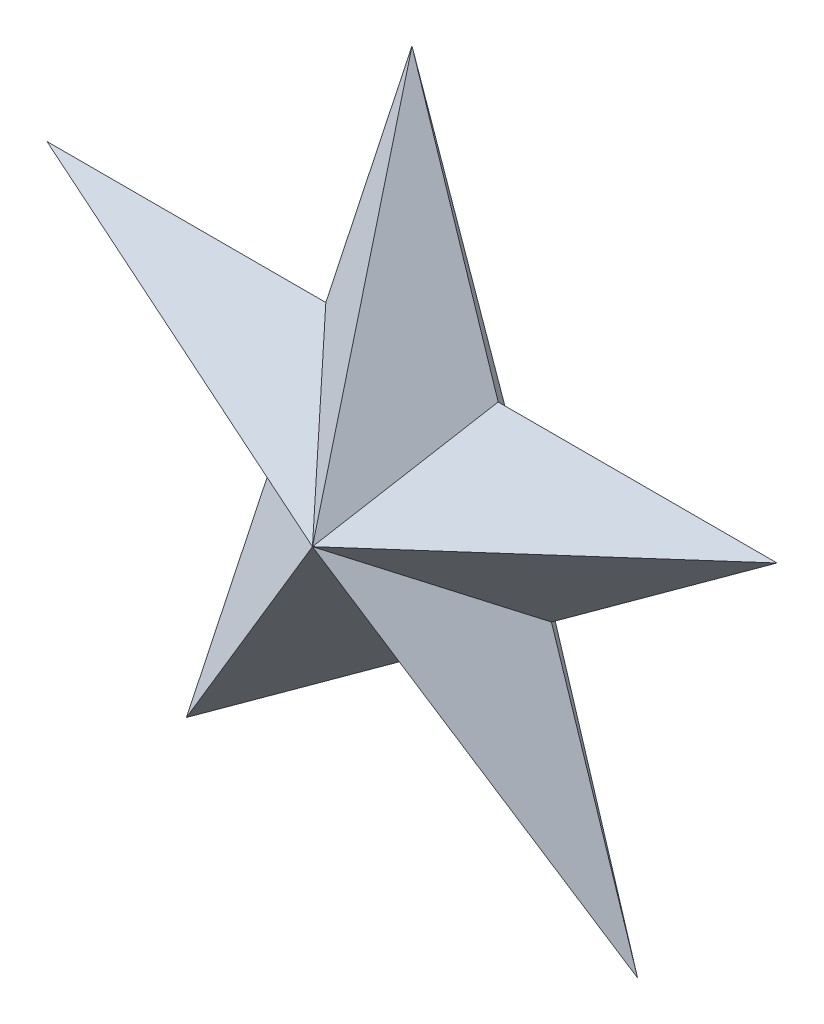
ISO-10303-21;
HEADER;
FILE_DESCRIPTION(('STEP AP214'),'2;1');
FILE_NAME('part.step','',(''),(''),'','','');
FILE_SCHEMA(('AUTOMOTIVE_DESIGN { 1 0 10303 214 1 1 1 1 }'));
ENDSEC;
DATA;
#1=APPLICATION_CONTEXT('core data for automotive mechanical design processes');
#2=APPLICATION_PROTOCOL_DEFINITION('international standard','automotive_design',2000,#1);
#3=PRODUCT_CONTEXT('',#1,'mechanical');
#4=PRODUCT('Part','Part','',(#3));
#5=PRODUCT_RELATED_PRODUCT_CATEGORY('part','',(#4));
#6=PRODUCT_DEFINITION_FORMATION('','',#4);
#7=PRODUCT_DEFINITION_CONTEXT('part definition',#1,'design');
#8=PRODUCT_DEFINITION('design','',#6,#7);
#9=PRODUCT_DEFINITION_SHAPE('','',#8);
#10=(LENGTH_UNIT() NAMED_UNIT(*) SI_UNIT(.MILLI.,.METRE.));
#11=(NAMED_UNIT(*) PLANE_ANGLE_UNIT() SI_UNIT($,.RADIAN.));
#12=(NAMED_UNIT(*) SI_UNIT($,.STERADIAN.) SOLID_ANGLE_UNIT());
#13=UNCERTAINTY_MEASURE_WITH_UNIT(LENGTH_MEASURE(1.E-05),#10,'distance_accuracy_value','');
#14=(GEOMETRIC_REPRESENTATION_CONTEXT(3) GLOBAL_UNCERTAINTY_ASSIGNED_CONTEXT((#13)) GLOBAL_UNIT_ASSIGNED_CONTEXT((#10,
#11,#12)) REPRESENTATION_CONTEXT('',''));
#15=CARTESIAN_POINT('',(0.,0.,0.));
#16=DIRECTION('',(0.,0.,1.));
#17=DIRECTION('',(1.,0.,0.));
#18=AXIS2_PLACEMENT_3D('',#15,#16,#17);
#19=CARTESIAN_POINT('',(55.9016994374964,18.1635632001327,0.));
#20=DIRECTION('',(0.611327344786174,0.198632295166773,-0.766044443118979));
#21=DIRECTION('',(-0.781618915499374,0.,-0.623756259233992));
#22=AXIS2_PLACEMENT_3D('',#19,#20,#21);
#23=PLANE('',#22);
#24=DIRECTION('',(0.309016994374919,-0.951056516295163,0.));
#25=VECTOR('',#24,1.);
#26=CARTESIAN_POINT('',(55.9016994374964,18.1635632001327,0.));
#27=LINE('',#26,#25);
#28=CARTESIAN_POINT('',(50.000000000002,36.3271264002678,0.));
#29=VERTEX_POINT('',#28);
#30=CARTESIAN_POINT('',(61.8033988749902,0.,0.));
#31=VERTEX_POINT('',#30);
#32=EDGE_CURVE('E107',#29,#31,#27,.T.);
#33=ORIENTED_EDGE('',*,*,#32,.T.);
#34=DIRECTION('',(0.486316038320695,0.66935660277975,0.561656878518563));
#35=VECTOR('',#34,1.);
#36=CARTESIAN_POINT('',(66.3202097747762,6.21685686065244,5.21656229885539));
#37=LINE('',#36,#35);
#38=CARTESIAN_POINT('',(49.9999999999999,-16.245984811645,-13.6319998635633));
#39=VERTEX_POINT('',#38);
#40=EDGE_CURVE('E11',#39,#31,#37,.T.);
#41=ORIENTED_EDGE('',*,*,#40,.F.);
#42=DIRECTION('',(0.,0.967988247041311,0.250995525039569));
#43=VECTOR('',#42,1.);
#44=CARTESIAN_POINT('',(50.0000000000015,19.3078450424926,-4.41303236196072));
#45=LINE('',#44,#43);
#46=EDGE_CURVE('E120',#39,#29,#45,.T.);
#47=ORIENTED_EDGE('',*,*,#46,.T.);
#48=EDGE_LOOP('',(#33,#41,#47));
#49=FACE_BOUND('',#48,.T.);
#50=ADVANCED_FACE('F41',(#49),#23,.T.);
#51=CARTESIAN_POINT('',(0.,0.,0.));
#52=DIRECTION('',(0.,0.642787609686538,-0.766044443118979));
#53=DIRECTION('',(0.,0.766044443118979,0.642787609686538));
#54=AXIS2_PLACEMENT_3D('',#51,#52,#53);
#55=PLANE('',#54);
#56=DIRECTION('',(1.,0.,0.));
#57=VECTOR('',#56,1.);
#58=CARTESIAN_POINT('',(0.,0.,0.));
#59=LINE('',#58,#57);
#60=CARTESIAN_POINT('',(100.,0.,0.));
#61=VERTEX_POINT('',#60);
#62=EDGE_CURVE('E124',#31,#61,#59,.T.);
#63=ORIENTED_EDGE('',*,*,#62,.T.);
#64=DIRECTION('',(0.920611530045763,0.299124818690978,0.250995525039569));
#65=VECTOR('',#64,1.);
#66=CARTESIAN_POINT('',(31.4337395126516,-22.2785285293753,-18.6939050721713));
#67=LINE('',#66,#65);
#68=EDGE_CURVE('E45',#39,#61,#67,.T.);
#69=ORIENTED_EDGE('',*,*,#68,.F.);
#70=ORIENTED_EDGE('',*,*,#40,.T.);
#71=EDGE_LOOP('',(#63,#69,#70));
#72=FACE_BOUND('',#71,.T.);
#73=ADVANCED_FACE('F43',(#72),#55,.T.);
#74=CARTESIAN_POINT('',(34.5491502812521,-47.5528258147575,0.));
#75=DIRECTION('',(0.377821077330075,-0.520026100010062,-0.766044443118979));
#76=DIRECTION('',(0.,0.827370262224101,-0.561656878518569));
#77=AXIS2_PLACEMENT_3D('',#74,#75,#76);
#78=PLANE('',#77);
#79=DIRECTION('',(-0.809016994374951,-0.587785252292469,0.));
#80=VECTOR('',#79,1.);
#81=CARTESIAN_POINT('',(34.5491502812521,-47.5528258147575,0.));
#82=LINE('',#81,#80);
#83=CARTESIAN_POINT('',(69.0983005625052,-22.4513988289791,0.));
#84=VERTEX_POINT('',#83);
#85=EDGE_CURVE('E64',#61,#84,#82,.T.);
#86=ORIENTED_EDGE('',*,*,#85,.T.);
#87=DIRECTION('',(0.786875879277055,-0.255671471667717,0.561656878518571));
#88=VECTOR('',#87,1.);
#89=CARTESIAN_POINT('',(52.7563252063231,-17.1415691604024,-11.6645879091039));
#90=LINE('',#89,#88);
#91=EDGE_CURVE('E181',#39,#84,#90,.T.);
#92=ORIENTED_EDGE('',*,*,#91,.F.);
#93=ORIENTED_EDGE('',*,*,#68,.T.);
#94=EDGE_LOOP('',(#86,#92,#93));
#95=FACE_BOUND('',#94,.T.);
#96=ADVANCED_FACE('F188',(#95),#78,.T.);
#97=CARTESIAN_POINT('',(55.9016994374964,18.1635632001327,0.));
#98=DIRECTION('',(0.611327344786174,0.198632295166773,-0.766044443118979));
#99=DIRECTION('',(-0.781618915499374,0.,-0.623756259233992));
#100=AXIS2_PLACEMENT_3D('',#97,#98,#99);
#101=PLANE('',#100);
#102=DIRECTION('',(0.309016994374919,-0.951056516295163,0.));
#103=VECTOR('',#102,1.);
#104=CARTESIAN_POINT('',(55.9016994374964,18.1635632001327,0.));
#105=LINE('',#104,#103);
#106=CARTESIAN_POINT('',(80.9016994374939,-58.7785252292485,0.));
#107=VERTEX_POINT('',#106);
#108=EDGE_CURVE('E152',#84,#107,#105,.T.);
#109=ORIENTED_EDGE('',*,*,#108,.T.);
#110=DIRECTION('',(0.568969216003308,-0.783118942211647,0.250995525039577));
#111=VECTOR('',#110,1.);
#112=CARTESIAN_POINT('',(28.5217373881198,13.3163075304795,-23.1069374341323));
#113=LINE('',#112,#111);
#114=EDGE_CURVE('E178',#39,#107,#113,.T.);
#115=ORIENTED_EDGE('',*,*,#114,.F.);
#116=ORIENTED_EDGE('',*,*,#91,.T.);
#117=EDGE_LOOP('',(#109,#115,#116));
#118=FACE_BOUND('',#117,.T.);
#119=ADVANCED_FACE('F276',(#118),#101,.T.);
#120=CARTESIAN_POINT('',(0.,0.,0.));
#121=DIRECTION('',(-0.377821077330085,-0.520026100010054,-0.766044443118979));
#122=DIRECTION('',(0.,0.827370262224105,-0.561656878518563));
#123=AXIS2_PLACEMENT_3D('',#120,#121,#122);
#124=PLANE('',#123);
#125=DIRECTION('',(-0.809016994374939,0.587785252292485,0.));
#126=VECTOR('',#125,1.);
#127=CARTESIAN_POINT('',(0.,0.,0.));
#128=LINE('',#127,#126);
#129=CARTESIAN_POINT('',(49.9999999999989,-36.3271264002684,0.));
#130=VERTEX_POINT('',#129);
#131=EDGE_CURVE('E148',#107,#130,#128,.T.);
#132=ORIENTED_EDGE('',*,*,#131,.T.);
#133=DIRECTION('',(0.,-0.827370262224103,0.561656878518566));
#134=VECTOR('',#133,1.);
#135=CARTESIAN_POINT('',(49.9999999999992,-11.4596989576571,-16.8811502079596));
#136=LINE('',#135,#134);
#137=EDGE_CURVE('E174',#39,#130,#136,.T.);
#138=ORIENTED_EDGE('',*,*,#137,.F.);
#139=ORIENTED_EDGE('',*,*,#114,.T.);
#140=EDGE_LOOP('',(#132,#138,#139));
#141=FACE_BOUND('',#140,.T.);
#142=ADVANCED_FACE('F272',(#141),#124,.T.);
#143=CARTESIAN_POINT('',(34.5491502812521,-47.5528258147575,0.));
#144=DIRECTION('',(0.377821077330075,-0.520026100010062,-0.766044443118979));
#145=DIRECTION('',(0.,0.827370262224101,-0.561656878518569));
#146=AXIS2_PLACEMENT_3D('',#143,#144,#145);
#147=PLANE('',#146);
#148=DIRECTION('',(-0.809016994374951,-0.587785252292469,0.));
#149=VECTOR('',#148,1.);
#150=CARTESIAN_POINT('',(34.5491502812521,-47.5528258147575,0.));
#151=LINE('',#150,#149);
#152=CARTESIAN_POINT('',(19.0983005625049,-58.7785252292469,0.));
#153=VERTEX_POINT('',#152);
#154=EDGE_CURVE('E144',#130,#153,#151,.T.);
#155=ORIENTED_EDGE('',*,*,#154,.T.);
#156=DIRECTION('',(-0.568969216003338,-0.783118942211628,0.250995525039565));
#157=VECTOR('',#156,1.);
#158=CARTESIAN_POINT('',(45.288281587193,-22.7311088493843,-11.5534687170654));
#159=LINE('',#158,#157);
#160=EDGE_CURVE('E170',#39,#153,#159,.T.);
#161=ORIENTED_EDGE('',*,*,#160,.F.);
#162=ORIENTED_EDGE('',*,*,#137,.T.);
#163=EDGE_LOOP('',(#155,#161,#162));
#164=FACE_BOUND('',#163,.T.);
#165=ADVANCED_FACE('F268',(#164),#147,.T.);
#166=CARTESIAN_POINT('',(34.5491502812531,-11.2256994144907,0.));
#167=DIRECTION('',(-0.611327344786163,0.198632295166806,-0.766044443118979));
#168=DIRECTION('',(-0.781618915499379,0.,0.623756259233985));
#169=AXIS2_PLACEMENT_3D('',#166,#167,#168);
#170=PLANE('',#169);
#171=DIRECTION('',(0.30901699437497,0.951056516295146,0.));
#172=VECTOR('',#171,1.);
#173=CARTESIAN_POINT('',(34.5491502812531,-11.2256994144907,0.));
#174=LINE('',#173,#172);
#175=CARTESIAN_POINT('',(30.901699437495,-22.4513988289801,0.));
#176=VERTEX_POINT('',#175);
#177=EDGE_CURVE('E140',#153,#176,#174,.T.);
#178=ORIENTED_EDGE('',*,*,#177,.T.);
#179=DIRECTION('',(-0.786875879277068,-0.255671471667689,0.561656878518566));
#180=VECTOR('',#179,1.);
#181=CARTESIAN_POINT('',(35.4185103372812,-20.9837980034802,-3.2240128051241));
#182=LINE('',#181,#180);
#183=EDGE_CURVE('E166',#39,#176,#182,.T.);
#184=ORIENTED_EDGE('',*,*,#183,.F.);
#185=ORIENTED_EDGE('',*,*,#160,.T.);
#186=EDGE_LOOP('',(#178,#184,#185));
#187=FACE_BOUND('',#186,.T.);
#188=ADVANCED_FACE('F264',(#187),#170,.T.);
#189=CARTESIAN_POINT('',(0.,0.,0.));
#190=DIRECTION('',(-0.377821077330085,-0.520026100010054,-0.766044443118979));
#191=DIRECTION('',(0.,0.827370262224105,-0.561656878518563));
#192=AXIS2_PLACEMENT_3D('',#189,#190,#191);
#193=PLANE('',#192);
#194=DIRECTION('',(-0.809016994374939,0.587785252292485,0.));
#195=VECTOR('',#194,1.);
#196=CARTESIAN_POINT('',(0.,0.,0.));
#197=LINE('',#196,#195);
#198=CARTESIAN_POINT('',(0.,0.,0.));
#199=VERTEX_POINT('',#198);
#200=EDGE_CURVE('E133',#176,#199,#197,.T.);
#201=ORIENTED_EDGE('',*,*,#200,.T.);
#202=DIRECTION('',(-0.920611530045758,0.299124818690986,0.250995525039576));
#203=VECTOR('',#202,1.);
#204=CARTESIAN_POINT('',(0.,0.,0.));
#205=LINE('',#204,#203);
#206=EDGE_CURVE('E162',#39,#199,#205,.T.);
#207=ORIENTED_EDGE('',*,*,#206,.F.);
#208=ORIENTED_EDGE('',*,*,#183,.T.);
#209=EDGE_LOOP('',(#201,#207,#208));
#210=FACE_BOUND('',#209,.T.);
#211=ADVANCED_FACE('F260',(#210),#193,.T.);
#212=CARTESIAN_POINT('',(0.,0.,0.));
#213=DIRECTION('',(0.,0.642787609686538,-0.766044443118979));
#214=DIRECTION('',(0.,0.766044443118979,0.642787609686538));
#215=AXIS2_PLACEMENT_3D('',#212,#213,#214);
#216=PLANE('',#215);
#217=DIRECTION('',(1.,0.,0.));
#218=VECTOR('',#217,1.);
#219=CARTESIAN_POINT('',(0.,0.,0.));
#220=LINE('',#219,#218);
#221=CARTESIAN_POINT('',(38.1966011250116,0.,0.));
#222=VERTEX_POINT('',#221);
#223=EDGE_CURVE('E130',#199,#222,#220,.T.);
#224=ORIENTED_EDGE('',*,*,#223,.T.);
#225=DIRECTION('',(-0.486316038320674,0.669356602779759,0.561656878518571));
#226=VECTOR('',#225,1.);
#227=CARTESIAN_POINT('',(29.1629793254393,12.4337137213059,10.4331245977116));
#228=LINE('',#227,#226);
#229=EDGE_CURVE('E123',#39,#222,#228,.T.);
#230=ORIENTED_EDGE('',*,*,#229,.F.);
#231=ORIENTED_EDGE('',*,*,#206,.T.);
#232=EDGE_LOOP('',(#224,#230,#231));
#233=FACE_BOUND('',#232,.T.);
#234=ADVANCED_FACE('F257',(#233),#216,.T.);
#235=CARTESIAN_POINT('',(34.5491502812531,-11.2256994144907,0.));
#236=DIRECTION('',(-0.611327344786163,0.198632295166806,-0.766044443118979));
#237=DIRECTION('',(-0.781618915499379,0.,0.623756259233985));
#238=AXIS2_PLACEMENT_3D('',#235,#236,#237);
#239=PLANE('',#238);
#240=DIRECTION('',(0.30901699437497,0.951056516295146,0.));
#241=VECTOR('',#240,1.);
#242=CARTESIAN_POINT('',(34.5491502812531,-11.2256994144907,0.));
#243=LINE('',#242,#241);
#244=EDGE_CURVE('E101',#222,#29,#243,.T.);
#245=ORIENTED_EDGE('',*,*,#244,.T.);
#246=ORIENTED_EDGE('',*,*,#46,.F.);
#247=ORIENTED_EDGE('',*,*,#229,.T.);
#248=EDGE_LOOP('',(#245,#246,#247));
#249=FACE_BOUND('',#248,.T.);
#250=ADVANCED_FACE('F126',(#249),#239,.T.);
#251=CARTESIAN_POINT('',(55.9016994374964,18.1635632001327,0.));
#252=DIRECTION('',(0.611327344786174,0.198632295166773,0.766044443118979));
#253=DIRECTION('',(0.781618915499374,0.,-0.623756259233992));
#254=AXIS2_PLACEMENT_3D('',#251,#252,#253);
#255=PLANE('',#254);
#256=ORIENTED_EDGE('',*,*,#32,.F.);
#257=DIRECTION('',(0.,0.967988247041311,-0.250995525039569));
#258=VECTOR('',#257,1.);
#259=CARTESIAN_POINT('',(50.0000000000008,-8.22993065848421,11.5534687170661));
#260=LINE('',#259,#258);
#261=CARTESIAN_POINT('',(50.0000000000009,-16.2459848116462,13.6319998635636));
#262=VERTEX_POINT('',#261);
#263=EDGE_CURVE('E97',#262,#29,#260,.T.);
#264=ORIENTED_EDGE('',*,*,#263,.F.);
#265=DIRECTION('',(0.486316038320695,0.66935660277975,-0.561656878518563));
#266=VECTOR('',#265,1.);
#267=CARTESIAN_POINT('',(47.1866917617692,-20.1181714074591,16.8811502079601));
#268=LINE('',#267,#266);
#269=EDGE_CURVE('E113',#262,#31,#268,.T.);
#270=ORIENTED_EDGE('',*,*,#269,.T.);
#271=EDGE_LOOP('',(#256,#264,#270));
#272=FACE_BOUND('',#271,.T.);
#273=ADVANCED_FACE('F111',(#272),#255,.T.);
#274=CARTESIAN_POINT('',(34.5491502812531,-11.2256994144907,0.));
#275=DIRECTION('',(-0.611327344786163,0.198632295166806,0.766044443118979));
#276=DIRECTION('',(0.781618915499379,0.,0.623756259233985));
#277=AXIS2_PLACEMENT_3D('',#274,#275,#276);
#278=PLANE('',#277);
#279=ORIENTED_EDGE('',*,*,#244,.F.);
#280=DIRECTION('',(-0.486316038320674,0.669356602779759,-0.561656878518571));
#281=VECTOR('',#280,1.);
#282=CARTESIAN_POINT('',(40.9881437818356,-3.84222884307676,3.22401280512441));
#283=LINE('',#282,#281);
#284=EDGE_CURVE('E103',#262,#222,#283,.T.);
#285=ORIENTED_EDGE('',*,*,#284,.F.);
#286=ORIENTED_EDGE('',*,*,#263,.T.);
#287=EDGE_LOOP('',(#279,#285,#286));
#288=FACE_BOUND('',#287,.T.);
#289=ADVANCED_FACE('F99',(#288),#278,.T.);
#290=CARTESIAN_POINT('',(0.,0.,0.));
#291=DIRECTION('',(0.,0.642787609686538,0.766044443118979));
#292=DIRECTION('',(0.,-0.766044443118979,0.642787609686538));
#293=AXIS2_PLACEMENT_3D('',#290,#291,#292);
#294=PLANE('',#293);
#295=ORIENTED_EDGE('',*,*,#223,.F.);
#296=DIRECTION('',(-0.920611530045758,0.299124818690986,-0.250995525039576));
#297=VECTOR('',#296,1.);
#298=CARTESIAN_POINT('',(0.,0.,0.));
#299=LINE('',#298,#297);
#300=EDGE_CURVE('E212',#262,#199,#299,.T.);
#301=ORIENTED_EDGE('',*,*,#300,.F.);
#302=ORIENTED_EDGE('',*,*,#284,.T.);
#303=EDGE_LOOP('',(#295,#301,#302));
#304=FACE_BOUND('',#303,.T.);
#305=ADVANCED_FACE('F217',(#304),#294,.T.);
#306=CARTESIAN_POINT('',(0.,0.,0.));
#307=DIRECTION('',(-0.377821077330085,-0.520026100010054,0.766044443118979));
#308=DIRECTION('',(0.,-0.827370262224105,-0.561656878518563));
#309=AXIS2_PLACEMENT_3D('',#306,#307,#308);
#310=PLANE('',#309);
#311=ORIENTED_EDGE('',*,*,#200,.F.);
#312=DIRECTION('',(-0.786875879277068,-0.255671471667689,-0.561656878518566));
#313=VECTOR('',#312,1.);
#314=CARTESIAN_POINT('',(16.2849923242744,-27.2006548641328,-10.4331245977117));
#315=LINE('',#314,#313);
#316=EDGE_CURVE('E209',#262,#176,#315,.T.);
#317=ORIENTED_EDGE('',*,*,#316,.F.);
#318=ORIENTED_EDGE('',*,*,#300,.T.);
#319=EDGE_LOOP('',(#311,#317,#318));
#320=FACE_BOUND('',#319,.T.);
#321=ADVANCED_FACE('F222',(#320),#310,.T.);
#322=CARTESIAN_POINT('',(34.5491502812531,-11.2256994144907,0.));
#323=DIRECTION('',(-0.611327344786163,0.198632295166806,0.766044443118979));
#324=DIRECTION('',(0.781618915499379,0.,0.623756259233985));
#325=AXIS2_PLACEMENT_3D('',#322,#323,#324);
#326=PLANE('',#325);
#327=ORIENTED_EDGE('',*,*,#177,.F.);
#328=DIRECTION('',(-0.568969216003338,-0.783118942211628,-0.250995525039565));
#329=VECTOR('',#328,1.);
#330=CARTESIAN_POINT('',(29.101983149221,-45.0096373787589,4.41303236196038));
#331=LINE('',#330,#329);
#332=EDGE_CURVE('E206',#262,#153,#331,.T.);
#333=ORIENTED_EDGE('',*,*,#332,.F.);
#334=ORIENTED_EDGE('',*,*,#316,.T.);
#335=EDGE_LOOP('',(#327,#333,#334));
#336=FACE_BOUND('',#335,.T.);
#337=ADVANCED_FACE('F226',(#336),#326,.T.);
#338=CARTESIAN_POINT('',(34.5491502812521,-47.5528258147575,0.));
#339=DIRECTION('',(0.377821077330075,-0.520026100010062,0.766044443118979));
#340=DIRECTION('',(0.,-0.827370262224101,-0.561656878518569));
#341=AXIS2_PLACEMENT_3D('',#338,#339,#340);
#342=PLANE('',#341);
#343=ORIENTED_EDGE('',*,*,#154,.F.);
#344=DIRECTION('',(0.,-0.827370262224103,-0.561656878518566));
#345=VECTOR('',#344,1.);
#346=CARTESIAN_POINT('',(49.9999999999988,-44.011584086421,-5.21656229885554));
#347=LINE('',#346,#345);
#348=EDGE_CURVE('E203',#262,#130,#347,.T.);
#349=ORIENTED_EDGE('',*,*,#348,.F.);
#350=ORIENTED_EDGE('',*,*,#332,.T.);
#351=EDGE_LOOP('',(#343,#349,#350));
#352=FACE_BOUND('',#351,.T.);
#353=ADVANCED_FACE('F230',(#352),#342,.T.);
#354=CARTESIAN_POINT('',(0.,0.,0.));
#355=DIRECTION('',(-0.377821077330085,-0.520026100010054,0.766044443118979));
#356=DIRECTION('',(0.,-0.827370262224105,-0.561656878518563));
#357=AXIS2_PLACEMENT_3D('',#354,#355,#356);
#358=PLANE('',#357);
#359=ORIENTED_EDGE('',*,*,#131,.F.);
#360=DIRECTION('',(0.568969216003308,-0.783118942211647,-0.250995525039577));
#361=VECTOR('',#360,1.);
#362=CARTESIAN_POINT('',(38.5254199748359,-0.452580320009496,18.6939050721715));
#363=LINE('',#362,#361);
#364=EDGE_CURVE('E197',#262,#107,#363,.T.);
#365=ORIENTED_EDGE('',*,*,#364,.F.);
#366=ORIENTED_EDGE('',*,*,#348,.T.);
#367=EDGE_LOOP('',(#359,#365,#366));
#368=FACE_BOUND('',#367,.T.);
#369=ADVANCED_FACE('F234',(#368),#358,.T.);
#370=CARTESIAN_POINT('',(55.9016994374964,18.1635632001327,0.));
#371=DIRECTION('',(0.611327344786174,0.198632295166773,0.766044443118979));
#372=DIRECTION('',(0.781618915499374,0.,-0.623756259233992));
#373=AXIS2_PLACEMENT_3D('',#370,#371,#372);
#374=PLANE('',#373);
#375=ORIENTED_EDGE('',*,*,#108,.F.);
#376=DIRECTION('',(0.786875879277055,-0.255671471667717,-0.561656878518571));
#377=VECTOR('',#376,1.);
#378=CARTESIAN_POINT('',(52.7563252063239,-17.1415691604027,11.6645879091033));
#379=LINE('',#378,#377);
#380=EDGE_CURVE('E193',#262,#84,#379,.T.);
#381=ORIENTED_EDGE('',*,*,#380,.F.);
#382=ORIENTED_EDGE('',*,*,#364,.T.);
#383=EDGE_LOOP('',(#375,#381,#382));
#384=FACE_BOUND('',#383,.T.);
#385=ADVANCED_FACE('F237',(#384),#374,.T.);
#386=CARTESIAN_POINT('',(34.5491502812521,-47.5528258147575,0.));
#387=DIRECTION('',(0.377821077330075,-0.520026100010062,0.766044443118979));
#388=DIRECTION('',(0.,-0.827370262224101,-0.561656878518569));
#389=AXIS2_PLACEMENT_3D('',#386,#387,#388);
#390=PLANE('',#389);
#391=ORIENTED_EDGE('',*,*,#85,.F.);
#392=DIRECTION('',(0.920611530045763,0.299124818690978,-0.250995525039569));
#393=VECTOR('',#392,1.);
#394=CARTESIAN_POINT('',(15.2474410746799,-27.5377757009762,23.1069374341317));
#395=LINE('',#394,#393);
#396=EDGE_CURVE('E191',#262,#61,#395,.T.);
#397=ORIENTED_EDGE('',*,*,#396,.F.);
#398=ORIENTED_EDGE('',*,*,#380,.T.);
#399=EDGE_LOOP('',(#391,#397,#398));
#400=FACE_BOUND('',#399,.T.);
#401=ADVANCED_FACE('F238',(#400),#390,.T.);
#402=CARTESIAN_POINT('',(0.,0.,0.));
#403=DIRECTION('',(0.,0.642787609686538,0.766044443118979));
#404=DIRECTION('',(0.,-0.766044443118979,0.642787609686538));
#405=AXIS2_PLACEMENT_3D('',#402,#403,#404);
#406=PLANE('',#405);
#407=ORIENTED_EDGE('',*,*,#62,.F.);
#408=ORIENTED_EDGE('',*,*,#269,.F.);
#409=ORIENTED_EDGE('',*,*,#396,.T.);
#410=EDGE_LOOP('',(#407,#408,#409));
#411=FACE_BOUND('',#410,.T.);
#412=ADVANCED_FACE('F190',(#411),#406,.T.);
#413=CLOSED_SHELL('',(#50,#73,#96,#119,#142,#165,#188,#211,#234,#250,#273,#289,#305,#321,#337,
#353,#369,#385,#401,#412));
#414=MANIFOLD_SOLID_BREP('B2',#413);
#415=ADVANCED_BREP_SHAPE_REPRESENTATION('',(#18,#414),#14);
#416=SHAPE_DEFINITION_REPRESENTATION(#9,#415);
ENDSEC;
END-ISO-10303-21;
